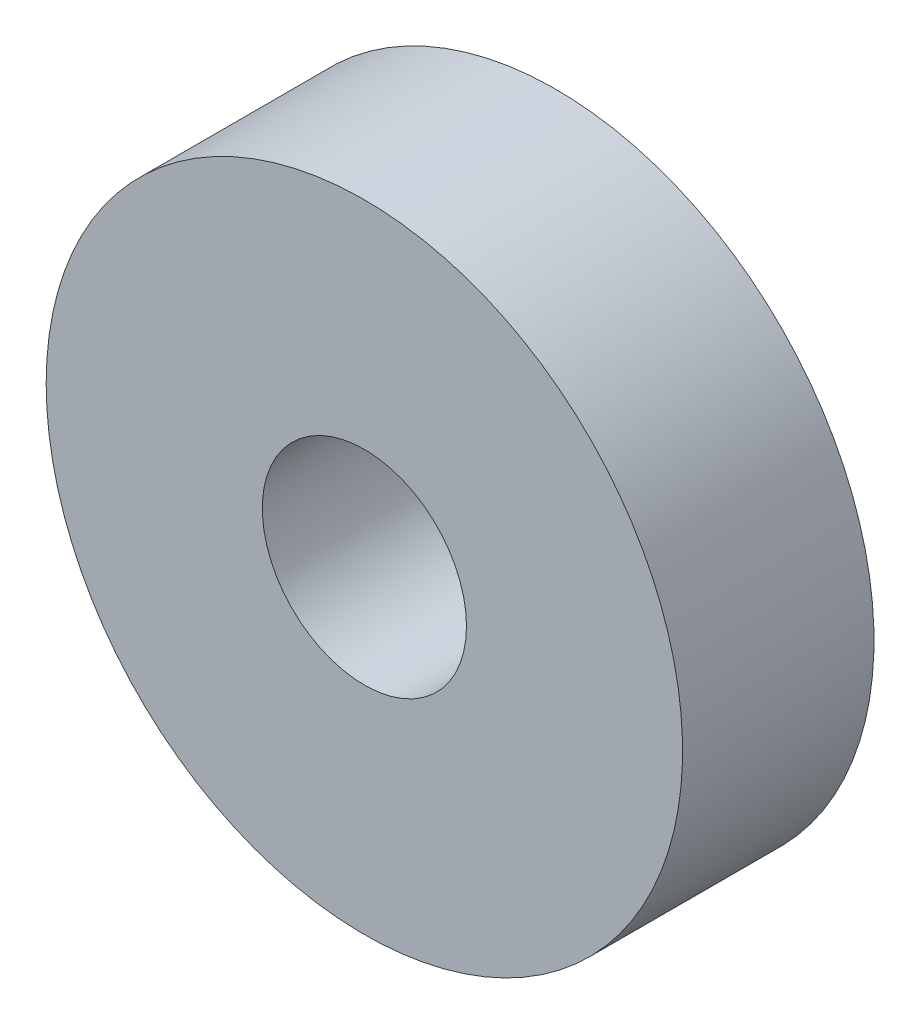
ISO-10303-21;
HEADER;
FILE_DESCRIPTION(('STEP AP214'),'2;1');
FILE_NAME('part.step','',(''),(''),'','','');
FILE_SCHEMA(('AUTOMOTIVE_DESIGN { 1 0 10303 214 1 1 1 1 }'));
ENDSEC;
DATA;
#1=APPLICATION_CONTEXT('core data for automotive mechanical design processes');
#2=APPLICATION_PROTOCOL_DEFINITION('international standard','automotive_design',2000,#1);
#3=PRODUCT_CONTEXT('',#1,'mechanical');
#4=PRODUCT('Part','Part','',(#3));
#5=PRODUCT_RELATED_PRODUCT_CATEGORY('part','',(#4));
#6=PRODUCT_DEFINITION_FORMATION('','',#4);
#7=PRODUCT_DEFINITION_CONTEXT('part definition',#1,'design');
#8=PRODUCT_DEFINITION('design','',#6,#7);
#9=PRODUCT_DEFINITION_SHAPE('','',#8);
#10=(LENGTH_UNIT() NAMED_UNIT(*) SI_UNIT(.MILLI.,.METRE.));
#11=(NAMED_UNIT(*) PLANE_ANGLE_UNIT() SI_UNIT($,.RADIAN.));
#12=(NAMED_UNIT(*) SI_UNIT($,.STERADIAN.) SOLID_ANGLE_UNIT());
#13=UNCERTAINTY_MEASURE_WITH_UNIT(LENGTH_MEASURE(1.E-05),#10,'distance_accuracy_value','');
#14=(GEOMETRIC_REPRESENTATION_CONTEXT(3) GLOBAL_UNCERTAINTY_ASSIGNED_CONTEXT((#13)) GLOBAL_UNIT_ASSIGNED_CONTEXT((#10,
#11,#12)) REPRESENTATION_CONTEXT('',''));
#15=CARTESIAN_POINT('',(0.,0.,0.));
#16=DIRECTION('',(0.,0.,1.));
#17=DIRECTION('',(1.,0.,0.));
#18=AXIS2_PLACEMENT_3D('',#15,#16,#17);
#19=CARTESIAN_POINT('',(0.,0.,3.));
#20=DIRECTION('',(0.,0.,-1.));
#21=DIRECTION('',(-1.,0.,0.));
#22=AXIS2_PLACEMENT_3D('',#19,#20,#21);
#23=CYLINDRICAL_SURFACE('',#22,4.98716201229748);
#24=CARTESIAN_POINT('',(0.,0.,3.));
#25=DIRECTION('',(0.,0.,-1.));
#26=DIRECTION('',(-1.,0.,0.));
#27=AXIS2_PLACEMENT_3D('',#24,#25,#26);
#28=CIRCLE('',#27,4.98716201229748);
#29=CARTESIAN_POINT('',(-4.98716201229748,0.,3.));
#30=VERTEX_POINT('',#29);
#31=EDGE_CURVE('E10',#30,#30,#28,.T.);
#32=ORIENTED_EDGE('',*,*,#31,.T.);
#33=EDGE_LOOP('',(#32));
#34=FACE_BOUND('',#33,.T.);
#35=CARTESIAN_POINT('',(0.,0.,0.));
#36=DIRECTION('',(0.,0.,-1.));
#37=DIRECTION('',(-1.,0.,0.));
#38=AXIS2_PLACEMENT_3D('',#35,#36,#37);
#39=CIRCLE('',#38,4.98716201229748);
#40=CARTESIAN_POINT('',(-4.98716201229748,0.,0.));
#41=VERTEX_POINT('',#40);
#42=EDGE_CURVE('E41',#41,#41,#39,.T.);
#43=ORIENTED_EDGE('',*,*,#42,.F.);
#44=EDGE_LOOP('',(#43));
#45=FACE_BOUND('',#44,.T.);
#46=ADVANCED_FACE('F35',(#34,#45),#23,.T.);
#47=CARTESIAN_POINT('',(4.98716201229748,0.,3.));
#48=DIRECTION('',(0.,0.,1.));
#49=DIRECTION('',(1.,0.,0.));
#50=AXIS2_PLACEMENT_3D('',#47,#48,#49);
#51=PLANE('',#50);
#52=CARTESIAN_POINT('',(0.,0.,3.));
#53=DIRECTION('',(0.,0.,1.));
#54=DIRECTION('',(1.,0.,0.));
#55=AXIS2_PLACEMENT_3D('',#52,#53,#54);
#56=CIRCLE('',#55,1.6);
#57=CARTESIAN_POINT('',(1.6,0.,3.));
#58=VERTEX_POINT('',#57);
#59=EDGE_CURVE('E49',#58,#58,#56,.T.);
#60=ORIENTED_EDGE('',*,*,#59,.F.);
#61=EDGE_LOOP('',(#60));
#62=FACE_BOUND('',#61,.T.);
#63=ORIENTED_EDGE('',*,*,#31,.F.);
#64=EDGE_LOOP('',(#63));
#65=FACE_BOUND('',#64,.T.);
#66=ADVANCED_FACE('F57',(#62,#65),#51,.T.);
#67=CARTESIAN_POINT('',(1.35,0.,0.));
#68=DIRECTION('',(0.,0.,-1.));
#69=DIRECTION('',(-1.,0.,0.));
#70=AXIS2_PLACEMENT_3D('',#67,#68,#69);
#71=PLANE('',#70);
#72=CARTESIAN_POINT('',(0.,0.,0.));
#73=DIRECTION('',(0.,0.,1.));
#74=DIRECTION('',(1.,0.,0.));
#75=AXIS2_PLACEMENT_3D('',#72,#73,#74);
#76=CIRCLE('',#75,1.6);
#77=CARTESIAN_POINT('',(1.6,0.,0.));
#78=VERTEX_POINT('',#77);
#79=EDGE_CURVE('E45',#78,#78,#76,.T.);
#80=ORIENTED_EDGE('',*,*,#79,.T.);
#81=EDGE_LOOP('',(#80));
#82=FACE_BOUND('',#81,.T.);
#83=ORIENTED_EDGE('',*,*,#42,.T.);
#84=EDGE_LOOP('',(#83));
#85=FACE_BOUND('',#84,.T.);
#86=ADVANCED_FACE('F60',(#82,#85),#71,.T.);
#87=CARTESIAN_POINT('',(0.,0.,0.));
#88=DIRECTION('',(0.,0.,1.));
#89=DIRECTION('',(1.,0.,0.));
#90=AXIS2_PLACEMENT_3D('',#87,#88,#89);
#91=CYLINDRICAL_SURFACE('',#90,1.6);
#92=ORIENTED_EDGE('',*,*,#79,.F.);
#93=EDGE_LOOP('',(#92));
#94=FACE_BOUND('',#93,.T.);
#95=ORIENTED_EDGE('',*,*,#59,.T.);
#96=EDGE_LOOP('',(#95));
#97=FACE_BOUND('',#96,.T.);
#98=ADVANCED_FACE('F55',(#94,#97),#91,.F.);
#99=CLOSED_SHELL('',(#46,#66,#86,#98));
#100=MANIFOLD_SOLID_BREP('B2',#99);
#101=ADVANCED_BREP_SHAPE_REPRESENTATION('',(#18,#100),#14);
#102=SHAPE_DEFINITION_REPRESENTATION(#9,#101);
ENDSEC;
END-ISO-10303-21;
